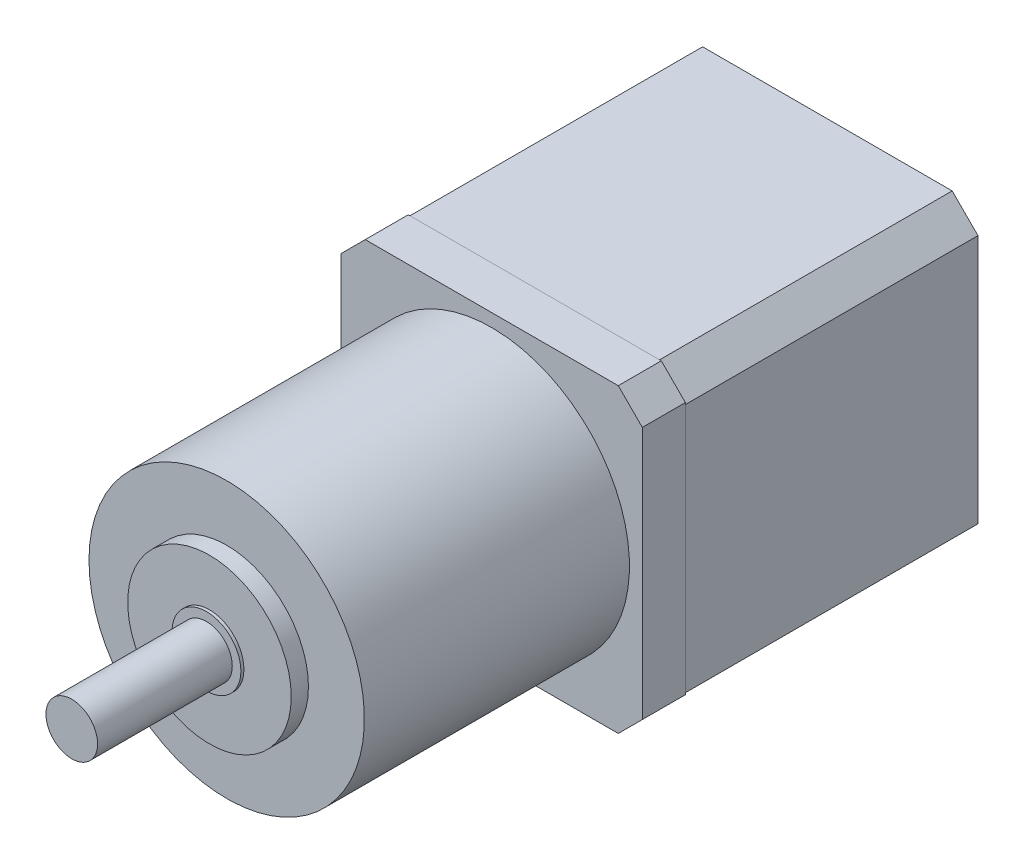
ISO-10303-21;
HEADER;
FILE_DESCRIPTION(('STEP AP214'),'2;1');
FILE_NAME('part.step','',(''),(''),'','','');
FILE_SCHEMA(('AUTOMOTIVE_DESIGN { 1 0 10303 214 1 1 1 1 }'));
ENDSEC;
DATA;
#1=APPLICATION_CONTEXT('core data for automotive mechanical design processes');
#2=APPLICATION_PROTOCOL_DEFINITION('international standard','automotive_design',2000,#1);
#3=PRODUCT_CONTEXT('',#1,'mechanical');
#4=PRODUCT('Part','Part','',(#3));
#5=PRODUCT_RELATED_PRODUCT_CATEGORY('part','',(#4));
#6=PRODUCT_DEFINITION_FORMATION('','',#4);
#7=PRODUCT_DEFINITION_CONTEXT('part definition',#1,'design');
#8=PRODUCT_DEFINITION('design','',#6,#7);
#9=PRODUCT_DEFINITION_SHAPE('','',#8);
#10=(LENGTH_UNIT() NAMED_UNIT(*) SI_UNIT(.MILLI.,.METRE.));
#11=(NAMED_UNIT(*) PLANE_ANGLE_UNIT() SI_UNIT($,.RADIAN.));
#12=(NAMED_UNIT(*) SI_UNIT($,.STERADIAN.) SOLID_ANGLE_UNIT());
#13=UNCERTAINTY_MEASURE_WITH_UNIT(LENGTH_MEASURE(1.E-05),#10,'distance_accuracy_value','');
#14=(GEOMETRIC_REPRESENTATION_CONTEXT(3) GLOBAL_UNCERTAINTY_ASSIGNED_CONTEXT((#13)) GLOBAL_UNIT_ASSIGNED_CONTEXT((#10,
#11,#12)) REPRESENTATION_CONTEXT('',''));
#15=CARTESIAN_POINT('',(0.,0.,0.));
#16=DIRECTION('',(0.,0.,1.));
#17=DIRECTION('',(1.,0.,0.));
#18=AXIS2_PLACEMENT_3D('',#15,#16,#17);
#19=CARTESIAN_POINT('',(17.5,-17.5,39.));
#20=DIRECTION('',(-1.,0.,0.));
#21=DIRECTION('',(0.,0.,1.));
#22=AXIS2_PLACEMENT_3D('',#19,#20,#21);
#23=PLANE('',#22);
#24=DIRECTION('',(0.,1.,0.));
#25=VECTOR('',#24,1.);
#26=CARTESIAN_POINT('',(17.5,-17.5,39.));
#27=LINE('',#26,#25);
#28=CARTESIAN_POINT('',(17.5,-14.7,39.));
#29=VERTEX_POINT('',#28);
#30=CARTESIAN_POINT('',(17.5,14.7,39.));
#31=VERTEX_POINT('',#30);
#32=EDGE_CURVE('E135',#29,#31,#27,.T.);
#33=ORIENTED_EDGE('',*,*,#32,.F.);
#34=DIRECTION('',(0.,0.,-1.));
#35=VECTOR('',#34,1.);
#36=CARTESIAN_POINT('',(17.5,-14.7,39.));
#37=LINE('',#36,#35);
#38=CARTESIAN_POINT('',(17.5,-14.7,34.));
#39=VERTEX_POINT('',#38);
#40=EDGE_CURVE('E161',#29,#39,#37,.T.);
#41=ORIENTED_EDGE('',*,*,#40,.T.);
#42=DIRECTION('',(0.,1.,0.));
#43=VECTOR('',#42,1.);
#44=CARTESIAN_POINT('',(17.5,-17.5,34.));
#45=LINE('',#44,#43);
#46=CARTESIAN_POINT('',(17.5,14.7,34.));
#47=VERTEX_POINT('',#46);
#48=EDGE_CURVE('E172',#39,#47,#45,.T.);
#49=ORIENTED_EDGE('',*,*,#48,.T.);
#50=DIRECTION('',(0.,0.,1.));
#51=VECTOR('',#50,1.);
#52=CARTESIAN_POINT('',(17.5,14.7,39.));
#53=LINE('',#52,#51);
#54=EDGE_CURVE('E159',#47,#31,#53,.T.);
#55=ORIENTED_EDGE('',*,*,#54,.T.);
#56=EDGE_LOOP('',(#33,#41,#49,#55));
#57=FACE_BOUND('',#56,.T.);
#58=ADVANCED_FACE('F42',(#57),#23,.F.);
#59=CARTESIAN_POINT('',(-17.5,17.5,39.));
#60=DIRECTION('',(0.,-1.,0.));
#61=DIRECTION('',(0.,0.,-1.));
#62=AXIS2_PLACEMENT_3D('',#59,#60,#61);
#63=PLANE('',#62);
#64=DIRECTION('',(-1.,0.,0.));
#65=VECTOR('',#64,1.);
#66=CARTESIAN_POINT('',(-17.5,17.5,34.));
#67=LINE('',#66,#65);
#68=CARTESIAN_POINT('',(14.7,17.5,34.));
#69=VERTEX_POINT('',#68);
#70=CARTESIAN_POINT('',(-14.7,17.5,34.));
#71=VERTEX_POINT('',#70);
#72=EDGE_CURVE('E140',#69,#71,#67,.T.);
#73=ORIENTED_EDGE('',*,*,#72,.T.);
#74=DIRECTION('',(0.,0.,1.));
#75=VECTOR('',#74,1.);
#76=CARTESIAN_POINT('',(-14.7,17.5,39.));
#77=LINE('',#76,#75);
#78=CARTESIAN_POINT('',(-14.7,17.5,39.));
#79=VERTEX_POINT('',#78);
#80=EDGE_CURVE('E51',#71,#79,#77,.T.);
#81=ORIENTED_EDGE('',*,*,#80,.T.);
#82=DIRECTION('',(-1.,0.,0.));
#83=VECTOR('',#82,1.);
#84=CARTESIAN_POINT('',(-17.5,17.5,39.));
#85=LINE('',#84,#83);
#86=CARTESIAN_POINT('',(14.7,17.5,39.));
#87=VERTEX_POINT('',#86);
#88=EDGE_CURVE('E138',#87,#79,#85,.T.);
#89=ORIENTED_EDGE('',*,*,#88,.F.);
#90=DIRECTION('',(0.,0.,-1.));
#91=VECTOR('',#90,1.);
#92=CARTESIAN_POINT('',(14.7,17.5,39.));
#93=LINE('',#92,#91);
#94=EDGE_CURVE('E164',#87,#69,#93,.T.);
#95=ORIENTED_EDGE('',*,*,#94,.T.);
#96=EDGE_LOOP('',(#73,#81,#89,#95));
#97=FACE_BOUND('',#96,.T.);
#98=ADVANCED_FACE('F169',(#97),#63,.F.);
#99=CARTESIAN_POINT('',(-17.5,-17.5,39.));
#100=DIRECTION('',(1.,0.,0.));
#101=DIRECTION('',(0.,0.,-1.));
#102=AXIS2_PLACEMENT_3D('',#99,#100,#101);
#103=PLANE('',#102);
#104=DIRECTION('',(0.,-1.,0.));
#105=VECTOR('',#104,1.);
#106=CARTESIAN_POINT('',(-17.5,-17.5,34.));
#107=LINE('',#106,#105);
#108=CARTESIAN_POINT('',(-17.5,14.7,34.));
#109=VERTEX_POINT('',#108);
#110=CARTESIAN_POINT('',(-17.5,-14.7,34.));
#111=VERTEX_POINT('',#110);
#112=EDGE_CURVE('E136',#109,#111,#107,.T.);
#113=ORIENTED_EDGE('',*,*,#112,.T.);
#114=DIRECTION('',(0.,0.,1.));
#115=VECTOR('',#114,1.);
#116=CARTESIAN_POINT('',(-17.5,-14.7,39.));
#117=LINE('',#116,#115);
#118=CARTESIAN_POINT('',(-17.5,-14.7,39.));
#119=VERTEX_POINT('',#118);
#120=EDGE_CURVE('E114',#111,#119,#117,.T.);
#121=ORIENTED_EDGE('',*,*,#120,.T.);
#122=DIRECTION('',(0.,-1.,0.));
#123=VECTOR('',#122,1.);
#124=CARTESIAN_POINT('',(-17.5,-17.5,39.));
#125=LINE('',#124,#123);
#126=CARTESIAN_POINT('',(-17.5,14.7,39.));
#127=VERTEX_POINT('',#126);
#128=EDGE_CURVE('E177',#127,#119,#125,.T.);
#129=ORIENTED_EDGE('',*,*,#128,.F.);
#130=DIRECTION('',(0.,0.,-1.));
#131=VECTOR('',#130,1.);
#132=CARTESIAN_POINT('',(-17.5,14.7,39.));
#133=LINE('',#132,#131);
#134=EDGE_CURVE('E119',#127,#109,#133,.T.);
#135=ORIENTED_EDGE('',*,*,#134,.T.);
#136=EDGE_LOOP('',(#113,#121,#129,#135));
#137=FACE_BOUND('',#136,.T.);
#138=ADVANCED_FACE('F225',(#137),#103,.F.);
#139=CARTESIAN_POINT('',(-17.5,-17.5,39.));
#140=DIRECTION('',(0.,1.,0.));
#141=DIRECTION('',(0.,0.,1.));
#142=AXIS2_PLACEMENT_3D('',#139,#140,#141);
#143=PLANE('',#142);
#144=DIRECTION('',(1.,0.,0.));
#145=VECTOR('',#144,1.);
#146=CARTESIAN_POINT('',(-17.5,-17.5,39.));
#147=LINE('',#146,#145);
#148=CARTESIAN_POINT('',(-14.7,-17.5,39.));
#149=VERTEX_POINT('',#148);
#150=CARTESIAN_POINT('',(14.7,-17.5,39.));
#151=VERTEX_POINT('',#150);
#152=EDGE_CURVE('E129',#149,#151,#147,.T.);
#153=ORIENTED_EDGE('',*,*,#152,.F.);
#154=DIRECTION('',(0.,0.,-1.));
#155=VECTOR('',#154,1.);
#156=CARTESIAN_POINT('',(-14.7,-17.5,39.));
#157=LINE('',#156,#155);
#158=CARTESIAN_POINT('',(-14.7,-17.5,34.));
#159=VERTEX_POINT('',#158);
#160=EDGE_CURVE('E113',#149,#159,#157,.T.);
#161=ORIENTED_EDGE('',*,*,#160,.T.);
#162=DIRECTION('',(1.,0.,0.));
#163=VECTOR('',#162,1.);
#164=CARTESIAN_POINT('',(-17.5,-17.5,34.));
#165=LINE('',#164,#163);
#166=CARTESIAN_POINT('',(14.7,-17.5,34.));
#167=VERTEX_POINT('',#166);
#168=EDGE_CURVE('E126',#159,#167,#165,.T.);
#169=ORIENTED_EDGE('',*,*,#168,.T.);
#170=DIRECTION('',(0.,0.,1.));
#171=VECTOR('',#170,1.);
#172=CARTESIAN_POINT('',(14.7,-17.5,39.));
#173=LINE('',#172,#171);
#174=EDGE_CURVE('E131',#167,#151,#173,.T.);
#175=ORIENTED_EDGE('',*,*,#174,.T.);
#176=EDGE_LOOP('',(#153,#161,#169,#175));
#177=FACE_BOUND('',#176,.T.);
#178=ADVANCED_FACE('F125',(#177),#143,.F.);
#179=CARTESIAN_POINT('',(0.,0.,39.));
#180=DIRECTION('',(0.,0.,-1.));
#181=DIRECTION('',(-1.,0.,0.));
#182=AXIS2_PLACEMENT_3D('',#179,#180,#181);
#183=PLANE('',#182);
#184=CARTESIAN_POINT('',(0.,0.,39.));
#185=DIRECTION('',(0.,0.,-1.));
#186=DIRECTION('',(-1.,0.,0.));
#187=AXIS2_PLACEMENT_3D('',#184,#185,#186);
#188=CIRCLE('',#187,16.);
#189=CARTESIAN_POINT('',(-16.,0.,39.));
#190=VERTEX_POINT('',#189);
#191=EDGE_CURVE('E12',#190,#190,#188,.F.);
#192=ORIENTED_EDGE('',*,*,#191,.F.);
#193=EDGE_LOOP('',(#192));
#194=FACE_BOUND('',#193,.T.);
#195=ORIENTED_EDGE('',*,*,#128,.T.);
#196=DIRECTION('',(-0.707106781186547,0.707106781186548,0.));
#197=VECTOR('',#196,1.);
#198=CARTESIAN_POINT('',(-14.7,-17.5,39.));
#199=LINE('',#198,#197);
#200=EDGE_CURVE('E157',#119,#149,#199,.F.);
#201=ORIENTED_EDGE('',*,*,#200,.T.);
#202=ORIENTED_EDGE('',*,*,#152,.T.);
#203=DIRECTION('',(-0.707106781186548,-0.707106781186547,0.));
#204=VECTOR('',#203,1.);
#205=CARTESIAN_POINT('',(17.5,-14.7,39.));
#206=LINE('',#205,#204);
#207=EDGE_CURVE('E155',#151,#29,#206,.F.);
#208=ORIENTED_EDGE('',*,*,#207,.T.);
#209=ORIENTED_EDGE('',*,*,#32,.T.);
#210=DIRECTION('',(0.707106781186547,-0.707106781186548,0.));
#211=VECTOR('',#210,1.);
#212=CARTESIAN_POINT('',(14.7,17.5,39.));
#213=LINE('',#212,#211);
#214=EDGE_CURVE('E64',#31,#87,#213,.F.);
#215=ORIENTED_EDGE('',*,*,#214,.T.);
#216=ORIENTED_EDGE('',*,*,#88,.T.);
#217=DIRECTION('',(0.707106781186548,0.707106781186547,0.));
#218=VECTOR('',#217,1.);
#219=CARTESIAN_POINT('',(-17.5,14.7,39.));
#220=LINE('',#219,#218);
#221=EDGE_CURVE('E153',#79,#127,#220,.F.);
#222=ORIENTED_EDGE('',*,*,#221,.T.);
#223=EDGE_LOOP('',(#195,#201,#202,#208,#209,#215,#216,#222));
#224=FACE_BOUND('',#223,.T.);
#225=ADVANCED_FACE('F245',(#194,#224),#183,.F.);
#226=CARTESIAN_POINT('',(0.,0.,34.));
#227=DIRECTION('',(0.,0.,-1.));
#228=DIRECTION('',(-1.,0.,0.));
#229=AXIS2_PLACEMENT_3D('',#226,#227,#228);
#230=PLANE('',#229);
#231=ORIENTED_EDGE('',*,*,#168,.F.);
#232=DIRECTION('',(0.707106781186547,-0.707106781186548,0.));
#233=VECTOR('',#232,1.);
#234=CARTESIAN_POINT('',(-16.1,-16.1,34.));
#235=LINE('',#234,#233);
#236=EDGE_CURVE('E109',#159,#111,#235,.F.);
#237=ORIENTED_EDGE('',*,*,#236,.T.);
#238=ORIENTED_EDGE('',*,*,#112,.F.);
#239=DIRECTION('',(-0.707106781186548,-0.707106781186547,0.));
#240=VECTOR('',#239,1.);
#241=CARTESIAN_POINT('',(-16.1,16.1,34.));
#242=LINE('',#241,#240);
#243=EDGE_CURVE('E146',#109,#71,#242,.F.);
#244=ORIENTED_EDGE('',*,*,#243,.T.);
#245=ORIENTED_EDGE('',*,*,#72,.F.);
#246=DIRECTION('',(-0.707106781186547,0.707106781186548,0.));
#247=VECTOR('',#246,1.);
#248=CARTESIAN_POINT('',(16.1,16.1,34.));
#249=LINE('',#248,#247);
#250=EDGE_CURVE('E130',#69,#47,#249,.F.);
#251=ORIENTED_EDGE('',*,*,#250,.T.);
#252=ORIENTED_EDGE('',*,*,#48,.F.);
#253=DIRECTION('',(0.707106781186548,0.707106781186547,0.));
#254=VECTOR('',#253,1.);
#255=CARTESIAN_POINT('',(16.1,-16.1,34.));
#256=LINE('',#255,#254);
#257=EDGE_CURVE('E120',#39,#167,#256,.F.);
#258=ORIENTED_EDGE('',*,*,#257,.T.);
#259=EDGE_LOOP('',(#231,#237,#238,#244,#245,#251,#252,#258));
#260=FACE_BOUND('',#259,.T.);
#261=ADVANCED_FACE('F133',(#260),#230,.T.);
#262=CARTESIAN_POINT('',(-14.7,-17.5,39.));
#263=DIRECTION('',(0.707106781186548,0.707106781186547,0.));
#264=DIRECTION('',(0.,0.,-1.));
#265=AXIS2_PLACEMENT_3D('',#262,#263,#264);
#266=PLANE('',#265);
#267=ORIENTED_EDGE('',*,*,#200,.F.);
#268=ORIENTED_EDGE('',*,*,#120,.F.);
#269=ORIENTED_EDGE('',*,*,#236,.F.);
#270=ORIENTED_EDGE('',*,*,#160,.F.);
#271=EDGE_LOOP('',(#267,#268,#269,#270));
#272=FACE_BOUND('',#271,.T.);
#273=ADVANCED_FACE('F112',(#272),#266,.F.);
#274=CARTESIAN_POINT('',(17.5,-14.7,39.));
#275=DIRECTION('',(-0.707106781186547,0.707106781186548,0.));
#276=DIRECTION('',(0.,0.,-1.));
#277=AXIS2_PLACEMENT_3D('',#274,#275,#276);
#278=PLANE('',#277);
#279=ORIENTED_EDGE('',*,*,#207,.F.);
#280=ORIENTED_EDGE('',*,*,#174,.F.);
#281=ORIENTED_EDGE('',*,*,#257,.F.);
#282=ORIENTED_EDGE('',*,*,#40,.F.);
#283=EDGE_LOOP('',(#279,#280,#281,#282));
#284=FACE_BOUND('',#283,.T.);
#285=ADVANCED_FACE('F232',(#284),#278,.F.);
#286=CARTESIAN_POINT('',(-17.5,14.7,39.));
#287=DIRECTION('',(0.707106781186547,-0.707106781186548,0.));
#288=DIRECTION('',(0.,0.,-1.));
#289=AXIS2_PLACEMENT_3D('',#286,#287,#288);
#290=PLANE('',#289);
#291=ORIENTED_EDGE('',*,*,#221,.F.);
#292=ORIENTED_EDGE('',*,*,#80,.F.);
#293=ORIENTED_EDGE('',*,*,#243,.F.);
#294=ORIENTED_EDGE('',*,*,#134,.F.);
#295=EDGE_LOOP('',(#291,#292,#293,#294));
#296=FACE_BOUND('',#295,.T.);
#297=ADVANCED_FACE('F234',(#296),#290,.F.);
#298=CARTESIAN_POINT('',(14.7,17.5,39.));
#299=DIRECTION('',(-0.707106781186548,-0.707106781186547,0.));
#300=DIRECTION('',(0.,0.,-1.));
#301=AXIS2_PLACEMENT_3D('',#298,#299,#300);
#302=PLANE('',#301);
#303=ORIENTED_EDGE('',*,*,#214,.F.);
#304=ORIENTED_EDGE('',*,*,#54,.F.);
#305=ORIENTED_EDGE('',*,*,#250,.F.);
#306=ORIENTED_EDGE('',*,*,#94,.F.);
#307=EDGE_LOOP('',(#303,#304,#305,#306));
#308=FACE_BOUND('',#307,.T.);
#309=ADVANCED_FACE('F44',(#308),#302,.F.);
#310=CARTESIAN_POINT('',(0.,0.,69.8));
#311=DIRECTION('',(0.,0.,-1.));
#312=DIRECTION('',(-1.,0.,0.));
#313=AXIS2_PLACEMENT_3D('',#310,#311,#312);
#314=CYLINDRICAL_SURFACE('',#313,16.);
#315=CARTESIAN_POINT('',(0.,0.,69.8));
#316=DIRECTION('',(0.,0.,1.));
#317=DIRECTION('',(1.,0.,0.));
#318=AXIS2_PLACEMENT_3D('',#315,#316,#317);
#319=CIRCLE('',#318,16.);
#320=CARTESIAN_POINT('',(-16.,0.,69.8));
#321=VERTEX_POINT('',#320);
#322=EDGE_CURVE('E173',#321,#321,#319,.T.);
#323=CARTESIAN_POINT('',(-16.,0.,69.8));
#324=CARTESIAN_POINT('',(-16.,0.,69.4791666666667));
#325=CARTESIAN_POINT('',(-16.,0.,69.1583333333333));
#326=CARTESIAN_POINT('',(-16.,0.,68.5166666666667));
#327=CARTESIAN_POINT('',(-16.,0.,68.1958333333333));
#328=CARTESIAN_POINT('',(-16.,0.,67.5541666666667));
#329=CARTESIAN_POINT('',(-16.,0.,67.2333333333333));
#330=CARTESIAN_POINT('',(-16.,0.,66.5916666666667));
#331=CARTESIAN_POINT('',(-16.,0.,66.2708333333333));
#332=CARTESIAN_POINT('',(-16.,0.,65.6291666666666));
#333=CARTESIAN_POINT('',(-16.,0.,65.3083333333333));
#334=CARTESIAN_POINT('',(-16.,0.,64.6666666666667));
#335=CARTESIAN_POINT('',(-16.,0.,64.3458333333333));
#336=CARTESIAN_POINT('',(-16.,0.,63.7041666666667));
#337=CARTESIAN_POINT('',(-16.,0.,63.3833333333333));
#338=CARTESIAN_POINT('',(-16.,0.,62.7416666666667));
#339=CARTESIAN_POINT('',(-16.,0.,62.4208333333333));
#340=CARTESIAN_POINT('',(-16.,0.,61.7791666666667));
#341=CARTESIAN_POINT('',(-16.,0.,61.4583333333333));
#342=CARTESIAN_POINT('',(-16.,0.,60.8166666666667));
#343=CARTESIAN_POINT('',(-16.,0.,60.4958333333333));
#344=CARTESIAN_POINT('',(-16.,0.,59.8541666666667));
#345=CARTESIAN_POINT('',(-16.,0.,59.5333333333333));
#346=CARTESIAN_POINT('',(-16.,0.,58.8916666666667));
#347=CARTESIAN_POINT('',(-16.,0.,58.5708333333333));
#348=CARTESIAN_POINT('',(-16.,0.,57.9291666666667));
#349=CARTESIAN_POINT('',(-16.,0.,57.6083333333333));
#350=CARTESIAN_POINT('',(-16.,0.,56.9666666666667));
#351=CARTESIAN_POINT('',(-16.,0.,56.6458333333333));
#352=CARTESIAN_POINT('',(-16.,0.,56.0041666666667));
#353=CARTESIAN_POINT('',(-16.,0.,55.6833333333333));
#354=CARTESIAN_POINT('',(-16.,0.,55.0416666666667));
#355=CARTESIAN_POINT('',(-16.,0.,54.7208333333333));
#356=CARTESIAN_POINT('',(-16.,0.,54.0791666666667));
#357=CARTESIAN_POINT('',(-16.,0.,53.7583333333333));
#358=CARTESIAN_POINT('',(-16.,0.,53.1166666666667));
#359=CARTESIAN_POINT('',(-16.,0.,52.7958333333333));
#360=CARTESIAN_POINT('',(-16.,0.,52.1541666666667));
#361=CARTESIAN_POINT('',(-16.,0.,51.8333333333333));
#362=CARTESIAN_POINT('',(-16.,0.,51.1916666666667));
#363=CARTESIAN_POINT('',(-16.,0.,50.8708333333333));
#364=CARTESIAN_POINT('',(-16.,0.,50.2291666666667));
#365=CARTESIAN_POINT('',(-16.,0.,49.9083333333333));
#366=CARTESIAN_POINT('',(-16.,0.,49.2666666666667));
#367=CARTESIAN_POINT('',(-16.,0.,48.9458333333333));
#368=CARTESIAN_POINT('',(-16.,0.,48.3041666666667));
#369=CARTESIAN_POINT('',(-16.,0.,47.9833333333333));
#370=CARTESIAN_POINT('',(-16.,0.,47.3416666666667));
#371=CARTESIAN_POINT('',(-16.,0.,47.0208333333333));
#372=CARTESIAN_POINT('',(-16.,0.,46.3791666666667));
#373=CARTESIAN_POINT('',(-16.,0.,46.0583333333333));
#374=CARTESIAN_POINT('',(-16.,0.,45.4166666666667));
#375=CARTESIAN_POINT('',(-16.,0.,45.0958333333333));
#376=CARTESIAN_POINT('',(-16.,0.,44.4541666666667));
#377=CARTESIAN_POINT('',(-16.,0.,44.1333333333333));
#378=CARTESIAN_POINT('',(-16.,0.,43.4916666666667));
#379=CARTESIAN_POINT('',(-16.,0.,43.1708333333333));
#380=CARTESIAN_POINT('',(-16.,0.,42.5291666666667));
#381=CARTESIAN_POINT('',(-16.,0.,42.2083333333333));
#382=CARTESIAN_POINT('',(-16.,0.,41.5666666666667));
#383=CARTESIAN_POINT('',(-16.,0.,41.2458333333333));
#384=CARTESIAN_POINT('',(-16.,0.,40.6041666666667));
#385=CARTESIAN_POINT('',(-16.,0.,40.2833333333333));
#386=CARTESIAN_POINT('',(-16.,0.,39.6416666666667));
#387=CARTESIAN_POINT('',(-16.,0.,39.3208333333333));
#388=CARTESIAN_POINT('',(-16.,0.,39.));
#389=B_SPLINE_CURVE_WITH_KNOTS('',3,(#323,#324,#325,#326,#327,#328,#329,#330,#331,#332,#333,
#334,#335,#336,#337,#338,#339,#340,#341,#342,#343,#344,#345,#346,#347,#348,#349,#350,#351,#352,
#353,#354,#355,#356,#357,#358,#359,#360,#361,#362,#363,#364,#365,#366,#367,#368,#369,#370,#371,
#372,#373,#374,#375,#376,#377,#378,#379,#380,#381,#382,#383,#384,#385,#386,#387,#388),
.UNSPECIFIED.,.F.,.F.,(4,2,2,2,2,2,2,2,2,2,2,2,2,2,2,2,2,2,2,2,2,2,2,2,2,2,2,2,2,2,2,2,4),(0.,
0.962500000000005,1.92500000000001,2.8875,3.85000000000001,4.81250000000001,5.775,
6.73750000000001,7.70000000000001,8.6625,9.625,10.5875,11.55,12.5125,13.475,14.4375,15.4,
16.3625,17.325,18.2875,19.25,20.2125,21.175,22.1375,23.1,24.0625,25.025,25.9875,26.95,27.9125,
28.875,29.8375,30.8),.UNSPECIFIED.);
#390=EDGE_CURVE('BSEAM241',#321,#190,#389,.T.);
#391=ORIENTED_EDGE('',*,*,#322,.F.);
#392=ORIENTED_EDGE('',*,*,#191,.T.);
#393=ORIENTED_EDGE('',*,*,#390,.T.);
#394=ORIENTED_EDGE('',*,*,#390,.F.);
#395=EDGE_LOOP('',(#391,#393,#392,#394));
#396=FACE_BOUND('',#395,.T.);
#397=ADVANCED_FACE('F241',(#396),#314,.T.);
#398=CARTESIAN_POINT('',(0.,0.,69.8));
#399=DIRECTION('',(0.,0.,1.));
#400=DIRECTION('',(1.,0.,0.));
#401=AXIS2_PLACEMENT_3D('',#398,#399,#400);
#402=PLANE('',#401);
#403=CARTESIAN_POINT('',(0.,0.,69.8));
#404=DIRECTION('',(0.,0.,1.));
#405=DIRECTION('',(1.,0.,0.));
#406=AXIS2_PLACEMENT_3D('',#403,#404,#405);
#407=CIRCLE('',#406,9.5);
#408=CARTESIAN_POINT('',(9.5,0.,69.8));
#409=VERTEX_POINT('',#408);
#410=EDGE_CURVE('E184',#409,#409,#407,.T.);
#411=ORIENTED_EDGE('',*,*,#410,.F.);
#412=EDGE_LOOP('',(#411));
#413=FACE_BOUND('',#412,.T.);
#414=ORIENTED_EDGE('',*,*,#322,.T.);
#415=EDGE_LOOP('',(#414));
#416=FACE_BOUND('',#415,.T.);
#417=ADVANCED_FACE('F260',(#413,#416),#402,.T.);
#418=CARTESIAN_POINT('',(0.,0.,71.8));
#419=DIRECTION('',(0.,0.,-1.));
#420=DIRECTION('',(-1.,0.,0.));
#421=AXIS2_PLACEMENT_3D('',#418,#419,#420);
#422=CYLINDRICAL_SURFACE('',#421,9.5);
#423=CARTESIAN_POINT('',(0.,0.,71.8));
#424=DIRECTION('',(0.,0.,1.));
#425=DIRECTION('',(1.,0.,0.));
#426=AXIS2_PLACEMENT_3D('',#423,#424,#425);
#427=CIRCLE('',#426,9.5);
#428=CARTESIAN_POINT('',(9.5,0.,71.8));
#429=VERTEX_POINT('',#428);
#430=EDGE_CURVE('E183',#429,#429,#427,.T.);
#431=ORIENTED_EDGE('',*,*,#430,.F.);
#432=EDGE_LOOP('',(#431));
#433=FACE_BOUND('',#432,.T.);
#434=ORIENTED_EDGE('',*,*,#410,.T.);
#435=EDGE_LOOP('',(#434));
#436=FACE_BOUND('',#435,.T.);
#437=ADVANCED_FACE('F264',(#433,#436),#422,.T.);
#438=CARTESIAN_POINT('',(0.,0.,71.8));
#439=DIRECTION('',(0.,0.,1.));
#440=DIRECTION('',(1.,0.,0.));
#441=AXIS2_PLACEMENT_3D('',#438,#439,#440);
#442=PLANE('',#441);
#443=CARTESIAN_POINT('',(0.,0.,71.8));
#444=DIRECTION('',(0.,0.,1.));
#445=DIRECTION('',(1.,0.,0.));
#446=AXIS2_PLACEMENT_3D('',#443,#444,#445);
#447=CIRCLE('',#446,4.);
#448=CARTESIAN_POINT('',(4.,0.,71.8));
#449=VERTEX_POINT('',#448);
#450=EDGE_CURVE('E192',#449,#449,#447,.T.);
#451=ORIENTED_EDGE('',*,*,#450,.F.);
#452=EDGE_LOOP('',(#451));
#453=FACE_BOUND('',#452,.T.);
#454=ORIENTED_EDGE('',*,*,#430,.T.);
#455=EDGE_LOOP('',(#454));
#456=FACE_BOUND('',#455,.T.);
#457=ADVANCED_FACE('F216',(#453,#456),#442,.T.);
#458=CARTESIAN_POINT('',(0.,0.,72.15));
#459=DIRECTION('',(0.,0.,-1.));
#460=DIRECTION('',(-1.,0.,0.));
#461=AXIS2_PLACEMENT_3D('',#458,#459,#460);
#462=CYLINDRICAL_SURFACE('',#461,4.);
#463=CARTESIAN_POINT('',(0.,0.,72.15));
#464=DIRECTION('',(0.,0.,1.));
#465=DIRECTION('',(1.,0.,0.));
#466=AXIS2_PLACEMENT_3D('',#463,#464,#465);
#467=CIRCLE('',#466,4.);
#468=CARTESIAN_POINT('',(4.,0.,72.15));
#469=VERTEX_POINT('',#468);
#470=EDGE_CURVE('E195',#469,#469,#467,.T.);
#471=ORIENTED_EDGE('',*,*,#470,.F.);
#472=EDGE_LOOP('',(#471));
#473=FACE_BOUND('',#472,.T.);
#474=ORIENTED_EDGE('',*,*,#450,.T.);
#475=EDGE_LOOP('',(#474));
#476=FACE_BOUND('',#475,.T.);
#477=ADVANCED_FACE('F208',(#473,#476),#462,.T.);
#478=CARTESIAN_POINT('',(0.,0.,72.15));
#479=DIRECTION('',(0.,0.,1.));
#480=DIRECTION('',(1.,0.,0.));
#481=AXIS2_PLACEMENT_3D('',#478,#479,#480);
#482=PLANE('',#481);
#483=CARTESIAN_POINT('',(0.,0.,72.15));
#484=DIRECTION('',(0.,0.,1.));
#485=DIRECTION('',(1.,0.,0.));
#486=AXIS2_PLACEMENT_3D('',#483,#484,#485);
#487=CIRCLE('',#486,3.);
#488=CARTESIAN_POINT('',(3.,0.,72.15));
#489=VERTEX_POINT('',#488);
#490=EDGE_CURVE('E46',#489,#489,#487,.T.);
#491=ORIENTED_EDGE('',*,*,#490,.F.);
#492=EDGE_LOOP('',(#491));
#493=FACE_BOUND('',#492,.T.);
#494=ORIENTED_EDGE('',*,*,#470,.T.);
#495=EDGE_LOOP('',(#494));
#496=FACE_BOUND('',#495,.T.);
#497=ADVANCED_FACE('F205',(#493,#496),#482,.T.);
#498=CARTESIAN_POINT('',(0.,0.,87.8));
#499=DIRECTION('',(0.,0.,1.));
#500=DIRECTION('',(1.,0.,0.));
#501=AXIS2_PLACEMENT_3D('',#498,#499,#500);
#502=PLANE('',#501);
#503=CARTESIAN_POINT('',(0.,0.,87.8));
#504=DIRECTION('',(0.,0.,1.));
#505=DIRECTION('',(1.,0.,0.));
#506=AXIS2_PLACEMENT_3D('',#503,#504,#505);
#507=CIRCLE('',#506,3.);
#508=CARTESIAN_POINT('',(3.,0.,87.8));
#509=VERTEX_POINT('',#508);
#510=EDGE_CURVE('E187',#509,#509,#507,.T.);
#511=ORIENTED_EDGE('',*,*,#510,.T.);
#512=EDGE_LOOP('',(#511));
#513=FACE_BOUND('',#512,.T.);
#514=ADVANCED_FACE('F207',(#513),#502,.T.);
#515=CARTESIAN_POINT('',(0.,0.,87.8));
#516=DIRECTION('',(0.,0.,-1.));
#517=DIRECTION('',(-1.,0.,0.));
#518=AXIS2_PLACEMENT_3D('',#515,#516,#517);
#519=CYLINDRICAL_SURFACE('',#518,3.);
#520=ORIENTED_EDGE('',*,*,#490,.T.);
#521=EDGE_LOOP('',(#520));
#522=FACE_BOUND('',#521,.T.);
#523=ORIENTED_EDGE('',*,*,#510,.F.);
#524=EDGE_LOOP('',(#523));
#525=FACE_BOUND('',#524,.T.);
#526=ADVANCED_FACE('F202',(#522,#525),#519,.T.);
#527=CLOSED_SHELL('',(#58,#98,#138,#178,#225,#261,#273,#285,#297,#309,#397,#417,#437,#457,#477,
#497,#514,#526));
#528=MANIFOLD_SOLID_BREP('B2',#527);
#529=CARTESIAN_POINT('',(17.5,17.5,34.));
#530=DIRECTION('',(-1.,0.,0.));
#531=DIRECTION('',(0.,-1.,0.));
#532=AXIS2_PLACEMENT_3D('',#529,#530,#531);
#533=PLANE('',#532);
#534=DIRECTION('',(0.,1.,0.));
#535=VECTOR('',#534,1.);
#536=CARTESIAN_POINT('',(17.5,17.5,34.));
#537=LINE('',#536,#535);
#538=CARTESIAN_POINT('',(17.5,-14.5,34.));
#539=VERTEX_POINT('',#538);
#540=CARTESIAN_POINT('',(17.5,14.5,34.));
#541=VERTEX_POINT('',#540);
#542=EDGE_CURVE('E480',#539,#541,#537,.T.);
#543=ORIENTED_EDGE('',*,*,#542,.F.);
#544=DIRECTION('',(0.,0.,-1.));
#545=VECTOR('',#544,1.);
#546=CARTESIAN_POINT('',(17.5,-14.5,34.));
#547=LINE('',#546,#545);
#548=CARTESIAN_POINT('',(17.5,-14.5,0.));
#549=VERTEX_POINT('',#548);
#550=EDGE_CURVE('E506',#539,#549,#547,.T.);
#551=ORIENTED_EDGE('',*,*,#550,.T.);
#552=DIRECTION('',(0.,1.,0.));
#553=VECTOR('',#552,1.);
#554=CARTESIAN_POINT('',(17.5,17.5,0.));
#555=LINE('',#554,#553);
#556=CARTESIAN_POINT('',(17.5,14.5,0.));
#557=VERTEX_POINT('',#556);
#558=EDGE_CURVE('E514',#549,#557,#555,.T.);
#559=ORIENTED_EDGE('',*,*,#558,.T.);
#560=DIRECTION('',(0.,0.,1.));
#561=VECTOR('',#560,1.);
#562=CARTESIAN_POINT('',(17.5,14.5,34.));
#563=LINE('',#562,#561);
#564=EDGE_CURVE('E504',#557,#541,#563,.T.);
#565=ORIENTED_EDGE('',*,*,#564,.T.);
#566=EDGE_LOOP('',(#543,#551,#559,#565));
#567=FACE_BOUND('',#566,.T.);
#568=ADVANCED_FACE('F389',(#567),#533,.F.);
#569=CARTESIAN_POINT('',(-17.5,17.5,34.));
#570=DIRECTION('',(0.,-1.,0.));
#571=DIRECTION('',(0.,0.,-1.));
#572=AXIS2_PLACEMENT_3D('',#569,#570,#571);
#573=PLANE('',#572);
#574=DIRECTION('',(-1.,0.,0.));
#575=VECTOR('',#574,1.);
#576=CARTESIAN_POINT('',(-17.5,17.5,0.));
#577=LINE('',#576,#575);
#578=CARTESIAN_POINT('',(14.5,17.5,0.));
#579=VERTEX_POINT('',#578);
#580=CARTESIAN_POINT('',(-14.5,17.5,0.));
#581=VERTEX_POINT('',#580);
#582=EDGE_CURVE('E485',#579,#581,#577,.T.);
#583=ORIENTED_EDGE('',*,*,#582,.T.);
#584=DIRECTION('',(0.,0.,1.));
#585=VECTOR('',#584,1.);
#586=CARTESIAN_POINT('',(-14.5,17.5,34.));
#587=LINE('',#586,#585);
#588=CARTESIAN_POINT('',(-14.5,17.5,34.));
#589=VERTEX_POINT('',#588);
#590=EDGE_CURVE('E40',#581,#589,#587,.T.);
#591=ORIENTED_EDGE('',*,*,#590,.T.);
#592=DIRECTION('',(-1.,0.,0.));
#593=VECTOR('',#592,1.);
#594=CARTESIAN_POINT('',(-17.5,17.5,34.));
#595=LINE('',#594,#593);
#596=CARTESIAN_POINT('',(14.5,17.5,34.));
#597=VERTEX_POINT('',#596);
#598=EDGE_CURVE('E483',#597,#589,#595,.T.);
#599=ORIENTED_EDGE('',*,*,#598,.F.);
#600=DIRECTION('',(0.,0.,-1.));
#601=VECTOR('',#600,1.);
#602=CARTESIAN_POINT('',(14.5,17.5,34.));
#603=LINE('',#602,#601);
#604=EDGE_CURVE('E397',#597,#579,#603,.T.);
#605=ORIENTED_EDGE('',*,*,#604,.T.);
#606=EDGE_LOOP('',(#583,#591,#599,#605));
#607=FACE_BOUND('',#606,.T.);
#608=ADVANCED_FACE('F511',(#607),#573,.F.);
#609=CARTESIAN_POINT('',(-17.5,17.5,34.));
#610=DIRECTION('',(1.,0.,0.));
#611=DIRECTION('',(0.,1.,0.));
#612=AXIS2_PLACEMENT_3D('',#609,#610,#611);
#613=PLANE('',#612);
#614=DIRECTION('',(0.,-1.,0.));
#615=VECTOR('',#614,1.);
#616=CARTESIAN_POINT('',(-17.5,17.5,0.));
#617=LINE('',#616,#615);
#618=CARTESIAN_POINT('',(-17.5,14.5,0.));
#619=VERTEX_POINT('',#618);
#620=CARTESIAN_POINT('',(-17.5,-14.5,0.));
#621=VERTEX_POINT('',#620);
#622=EDGE_CURVE('E481',#619,#621,#617,.T.);
#623=ORIENTED_EDGE('',*,*,#622,.T.);
#624=DIRECTION('',(0.,0.,1.));
#625=VECTOR('',#624,1.);
#626=CARTESIAN_POINT('',(-17.5,-14.5,34.));
#627=LINE('',#626,#625);
#628=CARTESIAN_POINT('',(-17.5,-14.5,34.));
#629=VERTEX_POINT('',#628);
#630=EDGE_CURVE('E459',#621,#629,#627,.T.);
#631=ORIENTED_EDGE('',*,*,#630,.T.);
#632=DIRECTION('',(0.,-1.,0.));
#633=VECTOR('',#632,1.);
#634=CARTESIAN_POINT('',(-17.5,17.5,34.));
#635=LINE('',#634,#633);
#636=CARTESIAN_POINT('',(-17.5,14.5,34.));
#637=VERTEX_POINT('',#636);
#638=EDGE_CURVE('E518',#637,#629,#635,.T.);
#639=ORIENTED_EDGE('',*,*,#638,.F.);
#640=DIRECTION('',(0.,0.,-1.));
#641=VECTOR('',#640,1.);
#642=CARTESIAN_POINT('',(-17.5,14.5,34.));
#643=LINE('',#642,#641);
#644=EDGE_CURVE('E464',#637,#619,#643,.T.);
#645=ORIENTED_EDGE('',*,*,#644,.T.);
#646=EDGE_LOOP('',(#623,#631,#639,#645));
#647=FACE_BOUND('',#646,.T.);
#648=ADVANCED_FACE('F528',(#647),#613,.F.);
#649=CARTESIAN_POINT('',(-17.5,-17.5,34.));
#650=DIRECTION('',(0.,1.,0.));
#651=DIRECTION('',(0.,0.,1.));
#652=AXIS2_PLACEMENT_3D('',#649,#650,#651);
#653=PLANE('',#652);
#654=DIRECTION('',(1.,0.,0.));
#655=VECTOR('',#654,1.);
#656=CARTESIAN_POINT('',(-17.5,-17.5,34.));
#657=LINE('',#656,#655);
#658=CARTESIAN_POINT('',(-14.5,-17.5,34.));
#659=VERTEX_POINT('',#658);
#660=CARTESIAN_POINT('',(14.5,-17.5,34.));
#661=VERTEX_POINT('',#660);
#662=EDGE_CURVE('E474',#659,#661,#657,.T.);
#663=ORIENTED_EDGE('',*,*,#662,.F.);
#664=DIRECTION('',(0.,0.,-1.));
#665=VECTOR('',#664,1.);
#666=CARTESIAN_POINT('',(-14.5,-17.5,34.));
#667=LINE('',#666,#665);
#668=CARTESIAN_POINT('',(-14.5,-17.5,0.));
#669=VERTEX_POINT('',#668);
#670=EDGE_CURVE('E458',#659,#669,#667,.T.);
#671=ORIENTED_EDGE('',*,*,#670,.T.);
#672=DIRECTION('',(1.,0.,0.));
#673=VECTOR('',#672,1.);
#674=CARTESIAN_POINT('',(-17.5,-17.5,0.));
#675=LINE('',#674,#673);
#676=CARTESIAN_POINT('',(14.5,-17.5,0.));
#677=VERTEX_POINT('',#676);
#678=EDGE_CURVE('E471',#669,#677,#675,.T.);
#679=ORIENTED_EDGE('',*,*,#678,.T.);
#680=DIRECTION('',(0.,0.,1.));
#681=VECTOR('',#680,1.);
#682=CARTESIAN_POINT('',(14.5,-17.5,34.));
#683=LINE('',#682,#681);
#684=EDGE_CURVE('E476',#677,#661,#683,.T.);
#685=ORIENTED_EDGE('',*,*,#684,.T.);
#686=EDGE_LOOP('',(#663,#671,#679,#685));
#687=FACE_BOUND('',#686,.T.);
#688=ADVANCED_FACE('F470',(#687),#653,.F.);
#689=CARTESIAN_POINT('',(0.,0.,34.));
#690=DIRECTION('',(0.,0.,1.));
#691=DIRECTION('',(1.,0.,0.));
#692=AXIS2_PLACEMENT_3D('',#689,#690,#691);
#693=PLANE('',#692);
#694=ORIENTED_EDGE('',*,*,#638,.T.);
#695=DIRECTION('',(-0.707106781186546,0.707106781186549,0.));
#696=VECTOR('',#695,1.);
#697=CARTESIAN_POINT('',(-16.,-16.,34.));
#698=LINE('',#697,#696);
#699=EDGE_CURVE('E502',#629,#659,#698,.F.);
#700=ORIENTED_EDGE('',*,*,#699,.T.);
#701=ORIENTED_EDGE('',*,*,#662,.T.);
#702=DIRECTION('',(-0.70710678118655,-0.707106781186546,0.));
#703=VECTOR('',#702,1.);
#704=CARTESIAN_POINT('',(16.,-16.,34.));
#705=LINE('',#704,#703);
#706=EDGE_CURVE('E500',#661,#539,#705,.F.);
#707=ORIENTED_EDGE('',*,*,#706,.T.);
#708=ORIENTED_EDGE('',*,*,#542,.T.);
#709=DIRECTION('',(0.707106781186546,-0.707106781186549,0.));
#710=VECTOR('',#709,1.);
#711=CARTESIAN_POINT('',(16.,16.,34.));
#712=LINE('',#711,#710);
#713=EDGE_CURVE('E409',#541,#597,#712,.F.);
#714=ORIENTED_EDGE('',*,*,#713,.T.);
#715=ORIENTED_EDGE('',*,*,#598,.T.);
#716=DIRECTION('',(0.707106781186549,0.707106781186546,0.));
#717=VECTOR('',#716,1.);
#718=CARTESIAN_POINT('',(-16.,16.,34.));
#719=LINE('',#718,#717);
#720=EDGE_CURVE('E498',#589,#637,#719,.F.);
#721=ORIENTED_EDGE('',*,*,#720,.T.);
#722=EDGE_LOOP('',(#694,#700,#701,#707,#708,#714,#715,#721));
#723=FACE_BOUND('',#722,.T.);
#724=ADVANCED_FACE('F522',(#723),#693,.T.);
#725=CARTESIAN_POINT('',(0.,0.,0.));
#726=DIRECTION('',(0.,0.,1.));
#727=DIRECTION('',(1.,0.,0.));
#728=AXIS2_PLACEMENT_3D('',#725,#726,#727);
#729=PLANE('',#728);
#730=ORIENTED_EDGE('',*,*,#678,.F.);
#731=DIRECTION('',(0.707106781186546,-0.707106781186549,0.));
#732=VECTOR('',#731,1.);
#733=CARTESIAN_POINT('',(-14.5,-17.5,0.));
#734=LINE('',#733,#732);
#735=EDGE_CURVE('E454',#669,#621,#734,.F.);
#736=ORIENTED_EDGE('',*,*,#735,.T.);
#737=ORIENTED_EDGE('',*,*,#622,.F.);
#738=DIRECTION('',(-0.707106781186549,-0.707106781186546,0.));
#739=VECTOR('',#738,1.);
#740=CARTESIAN_POINT('',(-17.5,14.5,0.));
#741=LINE('',#740,#739);
#742=EDGE_CURVE('E491',#619,#581,#741,.F.);
#743=ORIENTED_EDGE('',*,*,#742,.T.);
#744=ORIENTED_EDGE('',*,*,#582,.F.);
#745=DIRECTION('',(-0.707106781186546,0.707106781186549,0.));
#746=VECTOR('',#745,1.);
#747=CARTESIAN_POINT('',(14.5,17.5,0.));
#748=LINE('',#747,#746);
#749=EDGE_CURVE('E475',#579,#557,#748,.F.);
#750=ORIENTED_EDGE('',*,*,#749,.T.);
#751=ORIENTED_EDGE('',*,*,#558,.F.);
#752=DIRECTION('',(0.70710678118655,0.707106781186546,0.));
#753=VECTOR('',#752,1.);
#754=CARTESIAN_POINT('',(17.5,-14.5,0.));
#755=LINE('',#754,#753);
#756=EDGE_CURVE('E465',#549,#677,#755,.F.);
#757=ORIENTED_EDGE('',*,*,#756,.T.);
#758=EDGE_LOOP('',(#730,#736,#737,#743,#744,#750,#751,#757));
#759=FACE_BOUND('',#758,.T.);
#760=ADVANCED_FACE('F478',(#759),#729,.F.);
#761=CARTESIAN_POINT('',(-14.5,-17.5,34.));
#762=DIRECTION('',(0.707106781186549,0.707106781186546,0.));
#763=DIRECTION('',(0.,0.,-1.));
#764=AXIS2_PLACEMENT_3D('',#761,#762,#763);
#765=PLANE('',#764);
#766=ORIENTED_EDGE('',*,*,#699,.F.);
#767=ORIENTED_EDGE('',*,*,#630,.F.);
#768=ORIENTED_EDGE('',*,*,#735,.F.);
#769=ORIENTED_EDGE('',*,*,#670,.F.);
#770=EDGE_LOOP('',(#766,#767,#768,#769));
#771=FACE_BOUND('',#770,.T.);
#772=ADVANCED_FACE('F457',(#771),#765,.F.);
#773=CARTESIAN_POINT('',(17.5,-14.5,34.));
#774=DIRECTION('',(-0.707106781186546,0.70710678118655,0.));
#775=DIRECTION('',(0.,0.,-1.));
#776=AXIS2_PLACEMENT_3D('',#773,#774,#775);
#777=PLANE('',#776);
#778=ORIENTED_EDGE('',*,*,#706,.F.);
#779=ORIENTED_EDGE('',*,*,#684,.F.);
#780=ORIENTED_EDGE('',*,*,#756,.F.);
#781=ORIENTED_EDGE('',*,*,#550,.F.);
#782=EDGE_LOOP('',(#778,#779,#780,#781));
#783=FACE_BOUND('',#782,.T.);
#784=ADVANCED_FACE('F533',(#783),#777,.F.);
#785=CARTESIAN_POINT('',(-17.5,14.5,34.));
#786=DIRECTION('',(0.707106781186546,-0.707106781186549,0.));
#787=DIRECTION('',(0.,0.,-1.));
#788=AXIS2_PLACEMENT_3D('',#785,#786,#787);
#789=PLANE('',#788);
#790=ORIENTED_EDGE('',*,*,#720,.F.);
#791=ORIENTED_EDGE('',*,*,#590,.F.);
#792=ORIENTED_EDGE('',*,*,#742,.F.);
#793=ORIENTED_EDGE('',*,*,#644,.F.);
#794=EDGE_LOOP('',(#790,#791,#792,#793));
#795=FACE_BOUND('',#794,.T.);
#796=ADVANCED_FACE('F526',(#795),#789,.F.);
#797=CARTESIAN_POINT('',(14.5,17.5,34.));
#798=DIRECTION('',(-0.707106781186549,-0.707106781186546,0.));
#799=DIRECTION('',(0.,0.,-1.));
#800=AXIS2_PLACEMENT_3D('',#797,#798,#799);
#801=PLANE('',#800);
#802=ORIENTED_EDGE('',*,*,#713,.F.);
#803=ORIENTED_EDGE('',*,*,#564,.F.);
#804=ORIENTED_EDGE('',*,*,#749,.F.);
#805=ORIENTED_EDGE('',*,*,#604,.F.);
#806=EDGE_LOOP('',(#802,#803,#804,#805));
#807=FACE_BOUND('',#806,.T.);
#808=ADVANCED_FACE('F391',(#807),#801,.F.);
#809=CLOSED_SHELL('',(#568,#608,#648,#688,#724,#760,#772,#784,#796,#808));
#810=MANIFOLD_SOLID_BREP('B6',#809);
#811=ADVANCED_BREP_SHAPE_REPRESENTATION('',(#18,#528,#810),#14);
#812=SHAPE_DEFINITION_REPRESENTATION(#9,#811);
ENDSEC;
END-ISO-10303-21;
